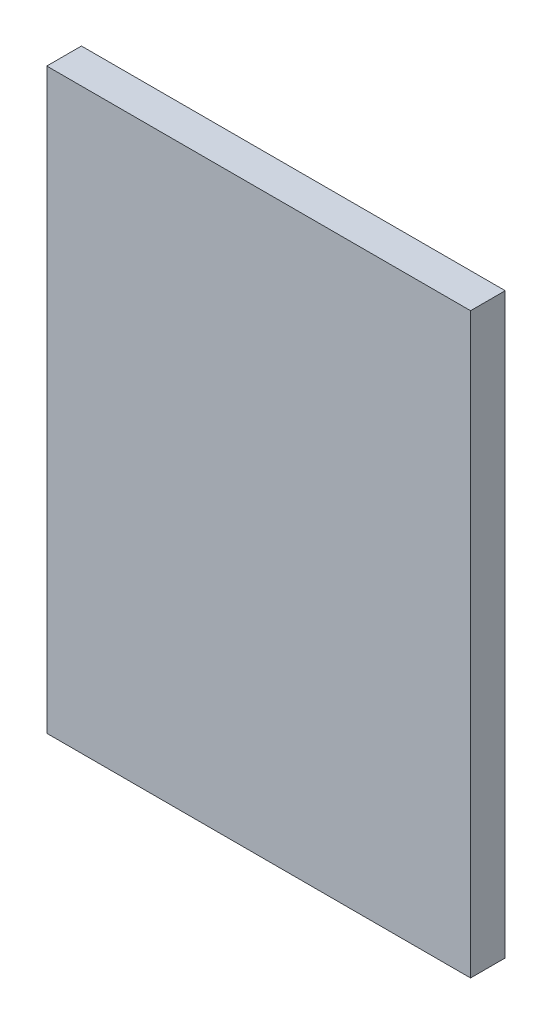
ISO-10303-21;
HEADER;
FILE_DESCRIPTION(('STEP AP214'),'2;1');
FILE_NAME('part.step','',(''),(''),'','','');
FILE_SCHEMA(('AUTOMOTIVE_DESIGN { 1 0 10303 214 1 1 1 1 }'));
ENDSEC;
DATA;
#1=APPLICATION_CONTEXT('core data for automotive mechanical design processes');
#2=APPLICATION_PROTOCOL_DEFINITION('international standard','automotive_design',2000,#1);
#3=PRODUCT_CONTEXT('',#1,'mechanical');
#4=PRODUCT('Part','Part','',(#3));
#5=PRODUCT_RELATED_PRODUCT_CATEGORY('part','',(#4));
#6=PRODUCT_DEFINITION_FORMATION('','',#4);
#7=PRODUCT_DEFINITION_CONTEXT('part definition',#1,'design');
#8=PRODUCT_DEFINITION('design','',#6,#7);
#9=PRODUCT_DEFINITION_SHAPE('','',#8);
#10=(LENGTH_UNIT() NAMED_UNIT(*) SI_UNIT(.MILLI.,.METRE.));
#11=(NAMED_UNIT(*) PLANE_ANGLE_UNIT() SI_UNIT($,.RADIAN.));
#12=(NAMED_UNIT(*) SI_UNIT($,.STERADIAN.) SOLID_ANGLE_UNIT());
#13=UNCERTAINTY_MEASURE_WITH_UNIT(LENGTH_MEASURE(1.E-05),#10,'distance_accuracy_value','');
#14=(GEOMETRIC_REPRESENTATION_CONTEXT(3) GLOBAL_UNCERTAINTY_ASSIGNED_CONTEXT((#13)) GLOBAL_UNIT_ASSIGNED_CONTEXT((#10,
#11,#12)) REPRESENTATION_CONTEXT('',''));
#15=CARTESIAN_POINT('',(0.,0.,0.));
#16=DIRECTION('',(0.,0.,1.));
#17=DIRECTION('',(1.,0.,0.));
#18=AXIS2_PLACEMENT_3D('',#15,#16,#17);
#19=CARTESIAN_POINT('',(110.,-150.,18.));
#20=DIRECTION('',(-1.,0.,0.));
#21=DIRECTION('',(0.,0.,1.));
#22=AXIS2_PLACEMENT_3D('',#19,#20,#21);
#23=PLANE('',#22);
#24=DIRECTION('',(0.,1.,0.));
#25=VECTOR('',#24,1.);
#26=CARTESIAN_POINT('',(110.,-150.,0.));
#27=LINE('',#26,#25);
#28=CARTESIAN_POINT('',(110.,-150.,0.));
#29=VERTEX_POINT('',#28);
#30=CARTESIAN_POINT('',(110.,150.,0.));
#31=VERTEX_POINT('',#30);
#32=EDGE_CURVE('E96',#29,#31,#27,.T.);
#33=ORIENTED_EDGE('',*,*,#32,.T.);
#34=DIRECTION('',(0.,0.,-1.));
#35=VECTOR('',#34,1.);
#36=CARTESIAN_POINT('',(110.,150.,18.));
#37=LINE('',#36,#35);
#38=CARTESIAN_POINT('',(110.,150.,18.));
#39=VERTEX_POINT('',#38);
#40=EDGE_CURVE('E11',#39,#31,#37,.T.);
#41=ORIENTED_EDGE('',*,*,#40,.F.);
#42=DIRECTION('',(0.,1.,0.));
#43=VECTOR('',#42,1.);
#44=CARTESIAN_POINT('',(110.,-150.,18.));
#45=LINE('',#44,#43);
#46=CARTESIAN_POINT('',(110.,-150.,18.));
#47=VERTEX_POINT('',#46);
#48=EDGE_CURVE('E84',#47,#39,#45,.T.);
#49=ORIENTED_EDGE('',*,*,#48,.F.);
#50=DIRECTION('',(0.,0.,-1.));
#51=VECTOR('',#50,1.);
#52=CARTESIAN_POINT('',(110.,-150.,18.));
#53=LINE('',#52,#51);
#54=EDGE_CURVE('E92',#47,#29,#53,.T.);
#55=ORIENTED_EDGE('',*,*,#54,.T.);
#56=EDGE_LOOP('',(#33,#41,#49,#55));
#57=FACE_BOUND('',#56,.T.);
#58=ADVANCED_FACE('F33',(#57),#23,.F.);
#59=CARTESIAN_POINT('',(-110.,150.,18.));
#60=DIRECTION('',(0.,-1.,0.));
#61=DIRECTION('',(0.,0.,-1.));
#62=AXIS2_PLACEMENT_3D('',#59,#60,#61);
#63=PLANE('',#62);
#64=DIRECTION('',(-1.,0.,0.));
#65=VECTOR('',#64,1.);
#66=CARTESIAN_POINT('',(-110.,150.,0.));
#67=LINE('',#66,#65);
#68=CARTESIAN_POINT('',(-110.,150.,0.));
#69=VERTEX_POINT('',#68);
#70=EDGE_CURVE('E88',#31,#69,#67,.T.);
#71=ORIENTED_EDGE('',*,*,#70,.T.);
#72=DIRECTION('',(0.,0.,-1.));
#73=VECTOR('',#72,1.);
#74=CARTESIAN_POINT('',(-110.,150.,18.));
#75=LINE('',#74,#73);
#76=CARTESIAN_POINT('',(-110.,150.,18.));
#77=VERTEX_POINT('',#76);
#78=EDGE_CURVE('E41',#77,#69,#75,.T.);
#79=ORIENTED_EDGE('',*,*,#78,.F.);
#80=DIRECTION('',(-1.,0.,0.));
#81=VECTOR('',#80,1.);
#82=CARTESIAN_POINT('',(-110.,150.,18.));
#83=LINE('',#82,#81);
#84=EDGE_CURVE('E79',#39,#77,#83,.T.);
#85=ORIENTED_EDGE('',*,*,#84,.F.);
#86=ORIENTED_EDGE('',*,*,#40,.T.);
#87=EDGE_LOOP('',(#71,#79,#85,#86));
#88=FACE_BOUND('',#87,.T.);
#89=ADVANCED_FACE('F87',(#88),#63,.F.);
#90=CARTESIAN_POINT('',(-110.,-150.,18.));
#91=DIRECTION('',(1.,0.,0.));
#92=DIRECTION('',(0.,0.,-1.));
#93=AXIS2_PLACEMENT_3D('',#90,#91,#92);
#94=PLANE('',#93);
#95=DIRECTION('',(0.,-1.,0.));
#96=VECTOR('',#95,1.);
#97=CARTESIAN_POINT('',(-110.,-150.,0.));
#98=LINE('',#97,#96);
#99=CARTESIAN_POINT('',(-110.,-150.,0.));
#100=VERTEX_POINT('',#99);
#101=EDGE_CURVE('E66',#69,#100,#98,.T.);
#102=ORIENTED_EDGE('',*,*,#101,.T.);
#103=DIRECTION('',(0.,0.,-1.));
#104=VECTOR('',#103,1.);
#105=CARTESIAN_POINT('',(-110.,-150.,18.));
#106=LINE('',#105,#104);
#107=CARTESIAN_POINT('',(-110.,-150.,18.));
#108=VERTEX_POINT('',#107);
#109=EDGE_CURVE('E89',#108,#100,#106,.T.);
#110=ORIENTED_EDGE('',*,*,#109,.F.);
#111=DIRECTION('',(0.,-1.,0.));
#112=VECTOR('',#111,1.);
#113=CARTESIAN_POINT('',(-110.,-150.,18.));
#114=LINE('',#113,#112);
#115=EDGE_CURVE('E82',#77,#108,#114,.T.);
#116=ORIENTED_EDGE('',*,*,#115,.F.);
#117=ORIENTED_EDGE('',*,*,#78,.T.);
#118=EDGE_LOOP('',(#102,#110,#116,#117));
#119=FACE_BOUND('',#118,.T.);
#120=ADVANCED_FACE('F90',(#119),#94,.F.);
#121=CARTESIAN_POINT('',(-110.,-150.,18.));
#122=DIRECTION('',(0.,1.,0.));
#123=DIRECTION('',(0.,0.,1.));
#124=AXIS2_PLACEMENT_3D('',#121,#122,#123);
#125=PLANE('',#124);
#126=DIRECTION('',(1.,0.,0.));
#127=VECTOR('',#126,1.);
#128=CARTESIAN_POINT('',(-110.,-150.,0.));
#129=LINE('',#128,#127);
#130=EDGE_CURVE('E72',#100,#29,#129,.T.);
#131=ORIENTED_EDGE('',*,*,#130,.T.);
#132=ORIENTED_EDGE('',*,*,#54,.F.);
#133=DIRECTION('',(1.,0.,0.));
#134=VECTOR('',#133,1.);
#135=CARTESIAN_POINT('',(-110.,-150.,18.));
#136=LINE('',#135,#134);
#137=EDGE_CURVE('E49',#108,#47,#136,.T.);
#138=ORIENTED_EDGE('',*,*,#137,.F.);
#139=ORIENTED_EDGE('',*,*,#109,.T.);
#140=EDGE_LOOP('',(#131,#132,#138,#139));
#141=FACE_BOUND('',#140,.T.);
#142=ADVANCED_FACE('F103',(#141),#125,.F.);
#143=CARTESIAN_POINT('',(0.,0.,18.));
#144=DIRECTION('',(0.,0.,-1.));
#145=DIRECTION('',(-1.,0.,0.));
#146=AXIS2_PLACEMENT_3D('',#143,#144,#145);
#147=PLANE('',#146);
#148=ORIENTED_EDGE('',*,*,#48,.T.);
#149=ORIENTED_EDGE('',*,*,#84,.T.);
#150=ORIENTED_EDGE('',*,*,#115,.T.);
#151=ORIENTED_EDGE('',*,*,#137,.T.);
#152=EDGE_LOOP('',(#148,#149,#150,#151));
#153=FACE_BOUND('',#152,.T.);
#154=ADVANCED_FACE('F80',(#153),#147,.F.);
#155=CARTESIAN_POINT('',(0.,0.,0.));
#156=DIRECTION('',(0.,0.,-1.));
#157=DIRECTION('',(-1.,0.,0.));
#158=AXIS2_PLACEMENT_3D('',#155,#156,#157);
#159=PLANE('',#158);
#160=ORIENTED_EDGE('',*,*,#32,.F.);
#161=ORIENTED_EDGE('',*,*,#130,.F.);
#162=ORIENTED_EDGE('',*,*,#101,.F.);
#163=ORIENTED_EDGE('',*,*,#70,.F.);
#164=EDGE_LOOP('',(#160,#161,#162,#163));
#165=FACE_BOUND('',#164,.T.);
#166=ADVANCED_FACE('F106',(#165),#159,.T.);
#167=CLOSED_SHELL('',(#58,#89,#120,#142,#154,#166));
#168=MANIFOLD_SOLID_BREP('B2',#167);
#169=ADVANCED_BREP_SHAPE_REPRESENTATION('',(#18,#168),#14);
#170=SHAPE_DEFINITION_REPRESENTATION(#9,#169);
ENDSEC;
END-ISO-10303-21;
